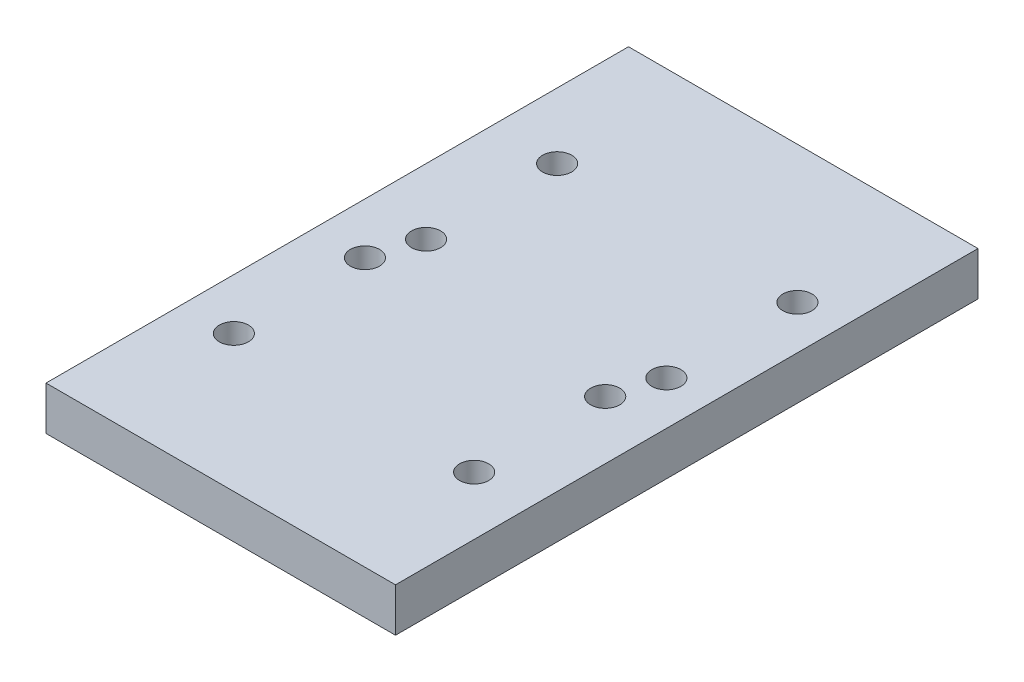
ISO-10303-21;
HEADER;
FILE_DESCRIPTION(('STEP AP214'),'2;1');
FILE_NAME('part.step','',(''),(''),'','','');
FILE_SCHEMA(('AUTOMOTIVE_DESIGN { 1 0 10303 214 1 1 1 1 }'));
ENDSEC;
DATA;
#1=APPLICATION_CONTEXT('core data for automotive mechanical design processes');
#2=APPLICATION_PROTOCOL_DEFINITION('international standard','automotive_design',2000,#1);
#3=PRODUCT_CONTEXT('',#1,'mechanical');
#4=PRODUCT('Part','Part','',(#3));
#5=PRODUCT_RELATED_PRODUCT_CATEGORY('part','',(#4));
#6=PRODUCT_DEFINITION_FORMATION('','',#4);
#7=PRODUCT_DEFINITION_CONTEXT('part definition',#1,'design');
#8=PRODUCT_DEFINITION('design','',#6,#7);
#9=PRODUCT_DEFINITION_SHAPE('','',#8);
#10=(LENGTH_UNIT() NAMED_UNIT(*) SI_UNIT(.MILLI.,.METRE.));
#11=(NAMED_UNIT(*) PLANE_ANGLE_UNIT() SI_UNIT($,.RADIAN.));
#12=(NAMED_UNIT(*) SI_UNIT($,.STERADIAN.) SOLID_ANGLE_UNIT());
#13=UNCERTAINTY_MEASURE_WITH_UNIT(LENGTH_MEASURE(1.E-05),#10,'distance_accuracy_value','');
#14=(GEOMETRIC_REPRESENTATION_CONTEXT(3) GLOBAL_UNCERTAINTY_ASSIGNED_CONTEXT((#13)) GLOBAL_UNIT_ASSIGNED_CONTEXT((#10,
#11,#12)) REPRESENTATION_CONTEXT('',''));
#15=CARTESIAN_POINT('',(0.,0.,0.));
#16=DIRECTION('',(0.,0.,1.));
#17=DIRECTION('',(1.,0.,0.));
#18=AXIS2_PLACEMENT_3D('',#15,#16,#17);
#19=CARTESIAN_POINT('',(24.,3.,80.));
#20=DIRECTION('',(-1.,0.,0.));
#21=DIRECTION('',(0.,0.,1.));
#22=AXIS2_PLACEMENT_3D('',#19,#20,#21);
#23=PLANE('',#22);
#24=DIRECTION('',(0.,1.,0.));
#25=VECTOR('',#24,1.);
#26=CARTESIAN_POINT('',(24.,3.,0.));
#27=LINE('',#26,#25);
#28=CARTESIAN_POINT('',(24.,-3.,0.));
#29=VERTEX_POINT('',#28);
#30=CARTESIAN_POINT('',(24.,3.,0.));
#31=VERTEX_POINT('',#30);
#32=EDGE_CURVE('E100',#29,#31,#27,.T.);
#33=ORIENTED_EDGE('',*,*,#32,.T.);
#34=DIRECTION('',(0.,0.,-1.));
#35=VECTOR('',#34,1.);
#36=CARTESIAN_POINT('',(24.,3.,80.));
#37=LINE('',#36,#35);
#38=CARTESIAN_POINT('',(24.,3.,80.));
#39=VERTEX_POINT('',#38);
#40=EDGE_CURVE('E11',#39,#31,#37,.T.);
#41=ORIENTED_EDGE('',*,*,#40,.F.);
#42=DIRECTION('',(0.,1.,0.));
#43=VECTOR('',#42,1.);
#44=CARTESIAN_POINT('',(24.,3.,80.));
#45=LINE('',#44,#43);
#46=CARTESIAN_POINT('',(24.,-3.,80.));
#47=VERTEX_POINT('',#46);
#48=EDGE_CURVE('E88',#47,#39,#45,.T.);
#49=ORIENTED_EDGE('',*,*,#48,.F.);
#50=DIRECTION('',(0.,0.,-1.));
#51=VECTOR('',#50,1.);
#52=CARTESIAN_POINT('',(24.,-3.,80.));
#53=LINE('',#52,#51);
#54=EDGE_CURVE('E96',#47,#29,#53,.T.);
#55=ORIENTED_EDGE('',*,*,#54,.T.);
#56=EDGE_LOOP('',(#33,#41,#49,#55));
#57=FACE_BOUND('',#56,.T.);
#58=ADVANCED_FACE('F37',(#57),#23,.F.);
#59=CARTESIAN_POINT('',(-24.,3.,80.));
#60=DIRECTION('',(0.,-1.,0.));
#61=DIRECTION('',(0.,0.,-1.));
#62=AXIS2_PLACEMENT_3D('',#59,#60,#61);
#63=PLANE('',#62);
#64=CARTESIAN_POINT('',(18.0000000000001,3.,36.8000000000001));
#65=DIRECTION('',(0.,-1.,0.));
#66=DIRECTION('',(0.,0.,-1.));
#67=AXIS2_PLACEMENT_3D('',#64,#65,#66);
#68=CIRCLE('',#67,2.);
#69=CARTESIAN_POINT('',(18.0000000000001,3.,34.8000000000001));
#70=VERTEX_POINT('',#69);
#71=EDGE_CURVE('E139',#70,#70,#68,.T.);
#72=ORIENTED_EDGE('',*,*,#71,.T.);
#73=EDGE_LOOP('',(#72));
#74=FACE_BOUND('',#73,.T.);
#75=CARTESIAN_POINT('',(18.0000000000001,3.,18.8000000000001));
#76=DIRECTION('',(0.,-1.,0.));
#77=DIRECTION('',(0.,0.,-1.));
#78=AXIS2_PLACEMENT_3D('',#75,#76,#77);
#79=CIRCLE('',#78,2.);
#80=CARTESIAN_POINT('',(18.0000000000001,3.,16.8000000000001));
#81=VERTEX_POINT('',#80);
#82=EDGE_CURVE('E133',#81,#81,#79,.T.);
#83=ORIENTED_EDGE('',*,*,#82,.T.);
#84=EDGE_LOOP('',(#83));
#85=FACE_BOUND('',#84,.T.);
#86=CARTESIAN_POINT('',(-16.9999999999999,3.,61.1999999999999));
#87=DIRECTION('',(0.,-1.,0.));
#88=DIRECTION('',(0.,0.,-1.));
#89=AXIS2_PLACEMENT_3D('',#86,#87,#88);
#90=CIRCLE('',#89,1.99999999999995);
#91=CARTESIAN_POINT('',(-16.9999999999999,3.,59.2));
#92=VERTEX_POINT('',#91);
#93=EDGE_CURVE('E127',#92,#92,#90,.T.);
#94=ORIENTED_EDGE('',*,*,#93,.T.);
#95=EDGE_LOOP('',(#94));
#96=FACE_BOUND('',#95,.T.);
#97=CARTESIAN_POINT('',(-14.9999999999999,3.,36.8000000000001));
#98=DIRECTION('',(0.,-1.,0.));
#99=DIRECTION('',(0.,0.,-1.));
#100=AXIS2_PLACEMENT_3D('',#97,#98,#99);
#101=CIRCLE('',#100,2.);
#102=CARTESIAN_POINT('',(-14.9999999999999,3.,34.8000000000001));
#103=VERTEX_POINT('',#102);
#104=EDGE_CURVE('E120',#103,#103,#101,.T.);
#105=ORIENTED_EDGE('',*,*,#104,.T.);
#106=EDGE_LOOP('',(#105));
#107=FACE_BOUND('',#106,.T.);
#108=CARTESIAN_POINT('',(-14.9999999999999,3.,18.8000000000001));
#109=DIRECTION('',(0.,-1.,0.));
#110=DIRECTION('',(0.,0.,-1.));
#111=AXIS2_PLACEMENT_3D('',#108,#109,#110);
#112=CIRCLE('',#111,2.);
#113=CARTESIAN_POINT('',(-14.9999999999999,3.,16.8000000000001));
#114=VERTEX_POINT('',#113);
#115=EDGE_CURVE('E156',#114,#114,#112,.T.);
#116=ORIENTED_EDGE('',*,*,#115,.T.);
#117=EDGE_LOOP('',(#116));
#118=FACE_BOUND('',#117,.T.);
#119=CARTESIAN_POINT('',(-16.9999999999999,3.,43.1999999999999));
#120=DIRECTION('',(0.,-1.,0.));
#121=DIRECTION('',(0.,0.,-1.));
#122=AXIS2_PLACEMENT_3D('',#119,#120,#121);
#123=CIRCLE('',#122,2.);
#124=CARTESIAN_POINT('',(-16.9999999999999,3.,41.1999999999999));
#125=VERTEX_POINT('',#124);
#126=EDGE_CURVE('E150',#125,#125,#123,.T.);
#127=ORIENTED_EDGE('',*,*,#126,.T.);
#128=EDGE_LOOP('',(#127));
#129=FACE_BOUND('',#128,.T.);
#130=CARTESIAN_POINT('',(16.0000000000002,3.,43.1999999999999));
#131=DIRECTION('',(0.,-1.,0.));
#132=DIRECTION('',(0.,0.,-1.));
#133=AXIS2_PLACEMENT_3D('',#130,#131,#132);
#134=CIRCLE('',#133,2.);
#135=CARTESIAN_POINT('',(16.0000000000002,3.,41.1999999999999));
#136=VERTEX_POINT('',#135);
#137=EDGE_CURVE('E144',#136,#136,#134,.T.);
#138=ORIENTED_EDGE('',*,*,#137,.T.);
#139=EDGE_LOOP('',(#138));
#140=FACE_BOUND('',#139,.T.);
#141=CARTESIAN_POINT('',(16.0000000000001,3.,61.1999999999999));
#142=DIRECTION('',(0.,-1.,0.));
#143=DIRECTION('',(0.,0.,-1.));
#144=AXIS2_PLACEMENT_3D('',#141,#142,#143);
#145=CIRCLE('',#144,1.99999999999995);
#146=CARTESIAN_POINT('',(16.0000000000001,3.,59.2));
#147=VERTEX_POINT('',#146);
#148=EDGE_CURVE('E103',#147,#147,#145,.T.);
#149=ORIENTED_EDGE('',*,*,#148,.T.);
#150=EDGE_LOOP('',(#149));
#151=FACE_BOUND('',#150,.T.);
#152=DIRECTION('',(-1.,0.,0.));
#153=VECTOR('',#152,1.);
#154=CARTESIAN_POINT('',(-24.,3.,0.));
#155=LINE('',#154,#153);
#156=CARTESIAN_POINT('',(-24.,3.,0.));
#157=VERTEX_POINT('',#156);
#158=EDGE_CURVE('E92',#31,#157,#155,.T.);
#159=ORIENTED_EDGE('',*,*,#158,.T.);
#160=DIRECTION('',(0.,0.,-1.));
#161=VECTOR('',#160,1.);
#162=CARTESIAN_POINT('',(-24.,3.,80.));
#163=LINE('',#162,#161);
#164=CARTESIAN_POINT('',(-24.,3.,80.));
#165=VERTEX_POINT('',#164);
#166=EDGE_CURVE('E45',#165,#157,#163,.T.);
#167=ORIENTED_EDGE('',*,*,#166,.F.);
#168=DIRECTION('',(-1.,0.,0.));
#169=VECTOR('',#168,1.);
#170=CARTESIAN_POINT('',(-24.,3.,80.));
#171=LINE('',#170,#169);
#172=EDGE_CURVE('E83',#39,#165,#171,.T.);
#173=ORIENTED_EDGE('',*,*,#172,.F.);
#174=ORIENTED_EDGE('',*,*,#40,.T.);
#175=EDGE_LOOP('',(#159,#167,#173,#174));
#176=FACE_BOUND('',#175,.T.);
#177=ADVANCED_FACE('F91',(#74,#85,#96,#107,#118,#129,#140,#151,#176),#63,.F.);
#178=CARTESIAN_POINT('',(-24.,3.,80.));
#179=DIRECTION('',(1.,0.,0.));
#180=DIRECTION('',(0.,0.,-1.));
#181=AXIS2_PLACEMENT_3D('',#178,#179,#180);
#182=PLANE('',#181);
#183=DIRECTION('',(0.,-1.,0.));
#184=VECTOR('',#183,1.);
#185=CARTESIAN_POINT('',(-24.,3.,0.));
#186=LINE('',#185,#184);
#187=CARTESIAN_POINT('',(-24.,-3.,0.));
#188=VERTEX_POINT('',#187);
#189=EDGE_CURVE('E70',#157,#188,#186,.T.);
#190=ORIENTED_EDGE('',*,*,#189,.T.);
#191=DIRECTION('',(0.,0.,-1.));
#192=VECTOR('',#191,1.);
#193=CARTESIAN_POINT('',(-24.,-3.,80.));
#194=LINE('',#193,#192);
#195=CARTESIAN_POINT('',(-24.,-3.,80.));
#196=VERTEX_POINT('',#195);
#197=EDGE_CURVE('E93',#196,#188,#194,.T.);
#198=ORIENTED_EDGE('',*,*,#197,.F.);
#199=DIRECTION('',(0.,-1.,0.));
#200=VECTOR('',#199,1.);
#201=CARTESIAN_POINT('',(-24.,3.,80.));
#202=LINE('',#201,#200);
#203=EDGE_CURVE('E86',#165,#196,#202,.T.);
#204=ORIENTED_EDGE('',*,*,#203,.F.);
#205=ORIENTED_EDGE('',*,*,#166,.T.);
#206=EDGE_LOOP('',(#190,#198,#204,#205));
#207=FACE_BOUND('',#206,.T.);
#208=ADVANCED_FACE('F94',(#207),#182,.F.);
#209=CARTESIAN_POINT('',(-24.,-3.,80.));
#210=DIRECTION('',(0.,1.,0.));
#211=DIRECTION('',(0.,0.,1.));
#212=AXIS2_PLACEMENT_3D('',#209,#210,#211);
#213=PLANE('',#212);
#214=CARTESIAN_POINT('',(18.0000000000001,-3.,36.8000000000001));
#215=DIRECTION('',(0.,-1.,0.));
#216=DIRECTION('',(0.,0.,-1.));
#217=AXIS2_PLACEMENT_3D('',#214,#215,#216);
#218=CIRCLE('',#217,2.);
#219=CARTESIAN_POINT('',(18.0000000000001,-3.,34.8000000000001));
#220=VERTEX_POINT('',#219);
#221=EDGE_CURVE('E117',#220,#220,#218,.T.);
#222=ORIENTED_EDGE('',*,*,#221,.F.);
#223=EDGE_LOOP('',(#222));
#224=FACE_BOUND('',#223,.T.);
#225=CARTESIAN_POINT('',(18.0000000000001,-3.,18.8000000000001));
#226=DIRECTION('',(0.,-1.,0.));
#227=DIRECTION('',(0.,0.,-1.));
#228=AXIS2_PLACEMENT_3D('',#225,#226,#227);
#229=CIRCLE('',#228,2.);
#230=CARTESIAN_POINT('',(18.0000000000001,-3.,16.8000000000001));
#231=VERTEX_POINT('',#230);
#232=EDGE_CURVE('E136',#231,#231,#229,.T.);
#233=ORIENTED_EDGE('',*,*,#232,.F.);
#234=EDGE_LOOP('',(#233));
#235=FACE_BOUND('',#234,.T.);
#236=CARTESIAN_POINT('',(-16.9999999999999,-3.,61.1999999999999));
#237=DIRECTION('',(0.,-1.,0.));
#238=DIRECTION('',(0.,0.,-1.));
#239=AXIS2_PLACEMENT_3D('',#236,#237,#238);
#240=CIRCLE('',#239,1.99999999999995);
#241=CARTESIAN_POINT('',(-16.9999999999999,-3.,59.2));
#242=VERTEX_POINT('',#241);
#243=EDGE_CURVE('E130',#242,#242,#240,.T.);
#244=ORIENTED_EDGE('',*,*,#243,.F.);
#245=EDGE_LOOP('',(#244));
#246=FACE_BOUND('',#245,.T.);
#247=CARTESIAN_POINT('',(-14.9999999999999,-3.,36.8000000000001));
#248=DIRECTION('',(0.,-1.,0.));
#249=DIRECTION('',(0.,0.,-1.));
#250=AXIS2_PLACEMENT_3D('',#247,#248,#249);
#251=CIRCLE('',#250,2.);
#252=CARTESIAN_POINT('',(-14.9999999999999,-3.,34.8000000000001));
#253=VERTEX_POINT('',#252);
#254=EDGE_CURVE('E123',#253,#253,#251,.T.);
#255=ORIENTED_EDGE('',*,*,#254,.F.);
#256=EDGE_LOOP('',(#255));
#257=FACE_BOUND('',#256,.T.);
#258=CARTESIAN_POINT('',(-14.9999999999999,-3.,18.8000000000001));
#259=DIRECTION('',(0.,-1.,0.));
#260=DIRECTION('',(0.,0.,-1.));
#261=AXIS2_PLACEMENT_3D('',#258,#259,#260);
#262=CIRCLE('',#261,2.);
#263=CARTESIAN_POINT('',(-14.9999999999999,-3.,16.8000000000001));
#264=VERTEX_POINT('',#263);
#265=EDGE_CURVE('E124',#264,#264,#262,.T.);
#266=ORIENTED_EDGE('',*,*,#265,.F.);
#267=EDGE_LOOP('',(#266));
#268=FACE_BOUND('',#267,.T.);
#269=CARTESIAN_POINT('',(-16.9999999999999,-3.,43.1999999999999));
#270=DIRECTION('',(0.,-1.,0.));
#271=DIRECTION('',(0.,0.,-1.));
#272=AXIS2_PLACEMENT_3D('',#269,#270,#271);
#273=CIRCLE('',#272,2.);
#274=CARTESIAN_POINT('',(-16.9999999999999,-3.,41.1999999999999));
#275=VERTEX_POINT('',#274);
#276=EDGE_CURVE('E153',#275,#275,#273,.T.);
#277=ORIENTED_EDGE('',*,*,#276,.F.);
#278=EDGE_LOOP('',(#277));
#279=FACE_BOUND('',#278,.T.);
#280=CARTESIAN_POINT('',(16.0000000000002,-3.,43.1999999999999));
#281=DIRECTION('',(0.,-1.,0.));
#282=DIRECTION('',(0.,0.,-1.));
#283=AXIS2_PLACEMENT_3D('',#280,#281,#282);
#284=CIRCLE('',#283,2.);
#285=CARTESIAN_POINT('',(16.0000000000002,-3.,41.1999999999999));
#286=VERTEX_POINT('',#285);
#287=EDGE_CURVE('E147',#286,#286,#284,.T.);
#288=ORIENTED_EDGE('',*,*,#287,.F.);
#289=EDGE_LOOP('',(#288));
#290=FACE_BOUND('',#289,.T.);
#291=CARTESIAN_POINT('',(16.0000000000001,-3.,61.1999999999999));
#292=DIRECTION('',(0.,-1.,0.));
#293=DIRECTION('',(0.,0.,-1.));
#294=AXIS2_PLACEMENT_3D('',#291,#292,#293);
#295=CIRCLE('',#294,1.99999999999995);
#296=CARTESIAN_POINT('',(16.0000000000001,-3.,59.2));
#297=VERTEX_POINT('',#296);
#298=EDGE_CURVE('E114',#297,#297,#295,.T.);
#299=ORIENTED_EDGE('',*,*,#298,.F.);
#300=EDGE_LOOP('',(#299));
#301=FACE_BOUND('',#300,.T.);
#302=DIRECTION('',(1.,0.,0.));
#303=VECTOR('',#302,1.);
#304=CARTESIAN_POINT('',(-24.,-3.,0.));
#305=LINE('',#304,#303);
#306=EDGE_CURVE('E76',#188,#29,#305,.T.);
#307=ORIENTED_EDGE('',*,*,#306,.T.);
#308=ORIENTED_EDGE('',*,*,#54,.F.);
#309=DIRECTION('',(1.,0.,0.));
#310=VECTOR('',#309,1.);
#311=CARTESIAN_POINT('',(-24.,-3.,80.));
#312=LINE('',#311,#310);
#313=EDGE_CURVE('E53',#196,#47,#312,.T.);
#314=ORIENTED_EDGE('',*,*,#313,.F.);
#315=ORIENTED_EDGE('',*,*,#197,.T.);
#316=EDGE_LOOP('',(#307,#308,#314,#315));
#317=FACE_BOUND('',#316,.T.);
#318=ADVANCED_FACE('F108',(#224,#235,#246,#257,#268,#279,#290,#301,#317),#213,.F.);
#319=CARTESIAN_POINT('',(0.,0.,80.));
#320=DIRECTION('',(0.,0.,1.));
#321=DIRECTION('',(1.,0.,0.));
#322=AXIS2_PLACEMENT_3D('',#319,#320,#321);
#323=PLANE('',#322);
#324=ORIENTED_EDGE('',*,*,#48,.T.);
#325=ORIENTED_EDGE('',*,*,#172,.T.);
#326=ORIENTED_EDGE('',*,*,#203,.T.);
#327=ORIENTED_EDGE('',*,*,#313,.T.);
#328=EDGE_LOOP('',(#324,#325,#326,#327));
#329=FACE_BOUND('',#328,.T.);
#330=ADVANCED_FACE('F84',(#329),#323,.T.);
#331=CARTESIAN_POINT('',(0.,0.,0.));
#332=DIRECTION('',(0.,0.,1.));
#333=DIRECTION('',(1.,0.,0.));
#334=AXIS2_PLACEMENT_3D('',#331,#332,#333);
#335=PLANE('',#334);
#336=ORIENTED_EDGE('',*,*,#32,.F.);
#337=ORIENTED_EDGE('',*,*,#306,.F.);
#338=ORIENTED_EDGE('',*,*,#189,.F.);
#339=ORIENTED_EDGE('',*,*,#158,.F.);
#340=EDGE_LOOP('',(#336,#337,#338,#339));
#341=FACE_BOUND('',#340,.T.);
#342=ADVANCED_FACE('F111',(#341),#335,.F.);
#343=CARTESIAN_POINT('',(16.0000000000001,3.,61.1999999999999));
#344=DIRECTION('',(0.,-1.,0.));
#345=DIRECTION('',(0.,0.,-1.));
#346=AXIS2_PLACEMENT_3D('',#343,#344,#345);
#347=CYLINDRICAL_SURFACE('',#346,1.99999999999995);
#348=ORIENTED_EDGE('',*,*,#148,.F.);
#349=EDGE_LOOP('',(#348));
#350=FACE_BOUND('',#349,.T.);
#351=ORIENTED_EDGE('',*,*,#298,.T.);
#352=EDGE_LOOP('',(#351));
#353=FACE_BOUND('',#352,.T.);
#354=ADVANCED_FACE('F174',(#350,#353),#347,.F.);
#355=CARTESIAN_POINT('',(16.0000000000002,3.,43.1999999999999));
#356=DIRECTION('',(0.,-1.,0.));
#357=DIRECTION('',(0.,0.,-1.));
#358=AXIS2_PLACEMENT_3D('',#355,#356,#357);
#359=CYLINDRICAL_SURFACE('',#358,2.);
#360=ORIENTED_EDGE('',*,*,#137,.F.);
#361=EDGE_LOOP('',(#360));
#362=FACE_BOUND('',#361,.T.);
#363=ORIENTED_EDGE('',*,*,#287,.T.);
#364=EDGE_LOOP('',(#363));
#365=FACE_BOUND('',#364,.T.);
#366=ADVANCED_FACE('F176',(#362,#365),#359,.F.);
#367=CARTESIAN_POINT('',(-16.9999999999999,3.,43.1999999999999));
#368=DIRECTION('',(0.,-1.,0.));
#369=DIRECTION('',(0.,0.,-1.));
#370=AXIS2_PLACEMENT_3D('',#367,#368,#369);
#371=CYLINDRICAL_SURFACE('',#370,2.);
#372=ORIENTED_EDGE('',*,*,#126,.F.);
#373=EDGE_LOOP('',(#372));
#374=FACE_BOUND('',#373,.T.);
#375=ORIENTED_EDGE('',*,*,#276,.T.);
#376=EDGE_LOOP('',(#375));
#377=FACE_BOUND('',#376,.T.);
#378=ADVANCED_FACE('F183',(#374,#377),#371,.F.);
#379=CARTESIAN_POINT('',(-14.9999999999999,3.,18.8000000000001));
#380=DIRECTION('',(0.,-1.,0.));
#381=DIRECTION('',(0.,0.,-1.));
#382=AXIS2_PLACEMENT_3D('',#379,#380,#381);
#383=CYLINDRICAL_SURFACE('',#382,2.);
#384=ORIENTED_EDGE('',*,*,#115,.F.);
#385=EDGE_LOOP('',(#384));
#386=FACE_BOUND('',#385,.T.);
#387=ORIENTED_EDGE('',*,*,#265,.T.);
#388=EDGE_LOOP('',(#387));
#389=FACE_BOUND('',#388,.T.);
#390=ADVANCED_FACE('F162',(#386,#389),#383,.F.);
#391=CARTESIAN_POINT('',(-14.9999999999999,3.,36.8000000000001));
#392=DIRECTION('',(0.,-1.,0.));
#393=DIRECTION('',(0.,0.,-1.));
#394=AXIS2_PLACEMENT_3D('',#391,#392,#393);
#395=CYLINDRICAL_SURFACE('',#394,2.);
#396=ORIENTED_EDGE('',*,*,#104,.F.);
#397=EDGE_LOOP('',(#396));
#398=FACE_BOUND('',#397,.T.);
#399=ORIENTED_EDGE('',*,*,#254,.T.);
#400=EDGE_LOOP('',(#399));
#401=FACE_BOUND('',#400,.T.);
#402=ADVANCED_FACE('F254',(#398,#401),#395,.F.);
#403=CARTESIAN_POINT('',(-16.9999999999999,3.,61.1999999999999));
#404=DIRECTION('',(0.,-1.,0.));
#405=DIRECTION('',(0.,0.,-1.));
#406=AXIS2_PLACEMENT_3D('',#403,#404,#405);
#407=CYLINDRICAL_SURFACE('',#406,1.99999999999995);
#408=ORIENTED_EDGE('',*,*,#93,.F.);
#409=EDGE_LOOP('',(#408));
#410=FACE_BOUND('',#409,.T.);
#411=ORIENTED_EDGE('',*,*,#243,.T.);
#412=EDGE_LOOP('',(#411));
#413=FACE_BOUND('',#412,.T.);
#414=ADVANCED_FACE('F265',(#410,#413),#407,.F.);
#415=CARTESIAN_POINT('',(18.0000000000001,3.,18.8000000000001));
#416=DIRECTION('',(0.,-1.,0.));
#417=DIRECTION('',(0.,0.,-1.));
#418=AXIS2_PLACEMENT_3D('',#415,#416,#417);
#419=CYLINDRICAL_SURFACE('',#418,2.);
#420=ORIENTED_EDGE('',*,*,#82,.F.);
#421=EDGE_LOOP('',(#420));
#422=FACE_BOUND('',#421,.T.);
#423=ORIENTED_EDGE('',*,*,#232,.T.);
#424=EDGE_LOOP('',(#423));
#425=FACE_BOUND('',#424,.T.);
#426=ADVANCED_FACE('F275',(#422,#425),#419,.F.);
#427=CARTESIAN_POINT('',(18.0000000000001,3.,36.8000000000001));
#428=DIRECTION('',(0.,-1.,0.));
#429=DIRECTION('',(0.,0.,-1.));
#430=AXIS2_PLACEMENT_3D('',#427,#428,#429);
#431=CYLINDRICAL_SURFACE('',#430,2.);
#432=ORIENTED_EDGE('',*,*,#71,.F.);
#433=EDGE_LOOP('',(#432));
#434=FACE_BOUND('',#433,.T.);
#435=ORIENTED_EDGE('',*,*,#221,.T.);
#436=EDGE_LOOP('',(#435));
#437=FACE_BOUND('',#436,.T.);
#438=ADVANCED_FACE('F286',(#434,#437),#431,.F.);
#439=CLOSED_SHELL('',(#58,#177,#208,#318,#330,#342,#354,#366,#378,#390,#402,#414,#426,#438));
#440=MANIFOLD_SOLID_BREP('B2',#439);
#441=ADVANCED_BREP_SHAPE_REPRESENTATION('',(#18,#440),#14);
#442=SHAPE_DEFINITION_REPRESENTATION(#9,#441);
ENDSEC;
END-ISO-10303-21;
